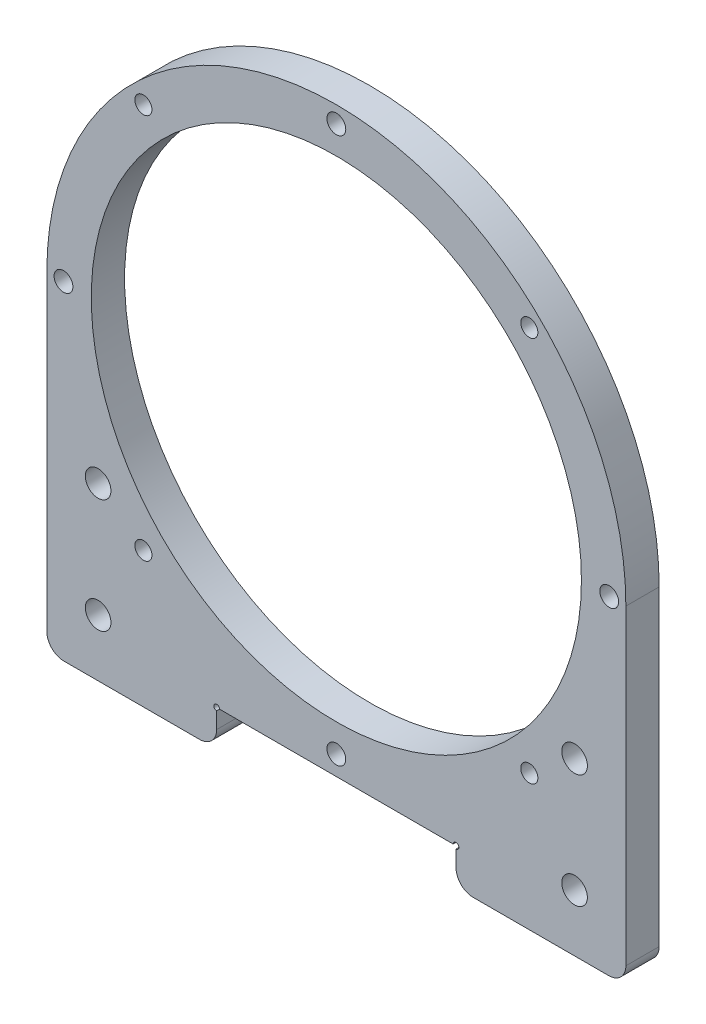
ISO-10303-21;
HEADER;
FILE_DESCRIPTION(('STEP AP214'),'2;1');
FILE_NAME('part.step','',(''),(''),'','','');
FILE_SCHEMA(('AUTOMOTIVE_DESIGN { 1 0 10303 214 1 1 1 1 }'));
ENDSEC;
DATA;
#1=APPLICATION_CONTEXT('core data for automotive mechanical design processes');
#2=APPLICATION_PROTOCOL_DEFINITION('international standard','automotive_design',2000,#1);
#3=PRODUCT_CONTEXT('',#1,'mechanical');
#4=PRODUCT('Part','Part','',(#3));
#5=PRODUCT_RELATED_PRODUCT_CATEGORY('part','',(#4));
#6=PRODUCT_DEFINITION_FORMATION('','',#4);
#7=PRODUCT_DEFINITION_CONTEXT('part definition',#1,'design');
#8=PRODUCT_DEFINITION('design','',#6,#7);
#9=PRODUCT_DEFINITION_SHAPE('','',#8);
#10=(LENGTH_UNIT() NAMED_UNIT(*) SI_UNIT(.MILLI.,.METRE.));
#11=(NAMED_UNIT(*) PLANE_ANGLE_UNIT() SI_UNIT($,.RADIAN.));
#12=(NAMED_UNIT(*) SI_UNIT($,.STERADIAN.) SOLID_ANGLE_UNIT());
#13=UNCERTAINTY_MEASURE_WITH_UNIT(LENGTH_MEASURE(1.E-05),#10,'distance_accuracy_value','');
#14=(GEOMETRIC_REPRESENTATION_CONTEXT(3) GLOBAL_UNCERTAINTY_ASSIGNED_CONTEXT((#13)) GLOBAL_UNIT_ASSIGNED_CONTEXT((#10,
#11,#12)) REPRESENTATION_CONTEXT('',''));
#15=CARTESIAN_POINT('',(0.,0.,0.));
#16=DIRECTION('',(0.,0.,1.));
#17=DIRECTION('',(1.,0.,0.));
#18=AXIS2_PLACEMENT_3D('',#15,#16,#17);
#19=CARTESIAN_POINT('',(0.,-57.658,5.842));
#20=DIRECTION('',(0.,1.,0.));
#21=DIRECTION('',(-1.,0.,0.));
#22=AXIS2_PLACEMENT_3D('',#19,#20,#21);
#23=PLANE('',#22);
#24=DIRECTION('',(1.,0.,0.));
#25=VECTOR('',#24,1.);
#26=CARTESIAN_POINT('',(0.,-57.658,0.));
#27=LINE('',#26,#25);
#28=CARTESIAN_POINT('',(-47.8,-57.658,0.));
#29=VERTEX_POINT('',#28);
#30=CARTESIAN_POINT('',(-24.,-57.658,0.));
#31=VERTEX_POINT('',#30);
#32=EDGE_CURVE('E263',#29,#31,#27,.T.);
#33=ORIENTED_EDGE('',*,*,#32,.T.);
#34=DIRECTION('',(0.,0.,1.));
#35=VECTOR('',#34,1.);
#36=CARTESIAN_POINT('',(-24.,-57.658,5.842));
#37=LINE('',#36,#35);
#38=CARTESIAN_POINT('',(-24.,-57.658,5.842));
#39=VERTEX_POINT('',#38);
#40=EDGE_CURVE('E309',#31,#39,#37,.T.);
#41=ORIENTED_EDGE('',*,*,#40,.T.);
#42=DIRECTION('',(1.,0.,0.));
#43=VECTOR('',#42,1.);
#44=CARTESIAN_POINT('',(0.,-57.658,5.842));
#45=LINE('',#44,#43);
#46=CARTESIAN_POINT('',(-47.8,-57.658,5.842));
#47=VERTEX_POINT('',#46);
#48=EDGE_CURVE('E213',#47,#39,#45,.T.);
#49=ORIENTED_EDGE('',*,*,#48,.F.);
#50=DIRECTION('',(0.,0.,-1.));
#51=VECTOR('',#50,1.);
#52=CARTESIAN_POINT('',(-47.8,-57.658,5.842));
#53=LINE('',#52,#51);
#54=EDGE_CURVE('E306',#47,#29,#53,.T.);
#55=ORIENTED_EDGE('',*,*,#54,.T.);
#56=EDGE_LOOP('',(#33,#41,#49,#55));
#57=FACE_BOUND('',#56,.T.);
#58=ADVANCED_FACE('F35',(#57),#23,.F.);
#59=CARTESIAN_POINT('',(0.,0.,5.842));
#60=DIRECTION('',(0.,0.,-1.));
#61=DIRECTION('',(-1.,0.,0.));
#62=AXIS2_PLACEMENT_3D('',#59,#60,#61);
#63=CYLINDRICAL_SURFACE('',#62,50.8);
#64=CARTESIAN_POINT('',(0.,0.,0.));
#65=DIRECTION('',(0.,0.,1.));
#66=DIRECTION('',(1.,0.,0.));
#67=AXIS2_PLACEMENT_3D('',#64,#65,#66);
#68=CIRCLE('',#67,50.8);
#69=CARTESIAN_POINT('',(-50.8,0.,0.));
#70=VERTEX_POINT('',#69);
#71=CARTESIAN_POINT('',(50.8,0.,0.));
#72=VERTEX_POINT('',#71);
#73=EDGE_CURVE('E254',#70,#72,#68,.F.);
#74=ORIENTED_EDGE('',*,*,#73,.F.);
#75=DIRECTION('',(0.,0.,-1.));
#76=VECTOR('',#75,1.);
#77=CARTESIAN_POINT('',(-50.8,0.,5.842));
#78=LINE('',#77,#76);
#79=CARTESIAN_POINT('',(-50.8,0.,5.842));
#80=VERTEX_POINT('',#79);
#81=EDGE_CURVE('E276',#80,#70,#78,.T.);
#82=ORIENTED_EDGE('',*,*,#81,.F.);
#83=CARTESIAN_POINT('',(0.,0.,5.842));
#84=DIRECTION('',(0.,0.,1.));
#85=DIRECTION('',(1.,0.,0.));
#86=AXIS2_PLACEMENT_3D('',#83,#84,#85);
#87=CIRCLE('',#86,50.8);
#88=CARTESIAN_POINT('',(50.8,0.,5.842));
#89=VERTEX_POINT('',#88);
#90=EDGE_CURVE('E206',#80,#89,#87,.F.);
#91=ORIENTED_EDGE('',*,*,#90,.T.);
#92=DIRECTION('',(0.,0.,-1.));
#93=VECTOR('',#92,1.);
#94=CARTESIAN_POINT('',(50.8,0.,5.842));
#95=LINE('',#94,#93);
#96=EDGE_CURVE('E227',#89,#72,#95,.T.);
#97=ORIENTED_EDGE('',*,*,#96,.T.);
#98=EDGE_LOOP('',(#74,#82,#91,#97));
#99=FACE_BOUND('',#98,.T.);
#100=ADVANCED_FACE('F337',(#99),#63,.T.);
#101=CARTESIAN_POINT('',(-50.8,0.,5.842));
#102=DIRECTION('',(1.,0.,0.));
#103=DIRECTION('',(0.,1.,0.));
#104=AXIS2_PLACEMENT_3D('',#101,#102,#103);
#105=PLANE('',#104);
#106=DIRECTION('',(0.,-1.,0.));
#107=VECTOR('',#106,1.);
#108=CARTESIAN_POINT('',(-50.8,0.,0.));
#109=LINE('',#108,#107);
#110=CARTESIAN_POINT('',(-50.8,-54.658,0.));
#111=VERTEX_POINT('',#110);
#112=EDGE_CURVE('E257',#70,#111,#109,.T.);
#113=ORIENTED_EDGE('',*,*,#112,.T.);
#114=DIRECTION('',(0.,0.,-1.));
#115=VECTOR('',#114,1.);
#116=CARTESIAN_POINT('',(-50.8,-54.658,5.842));
#117=LINE('',#116,#115);
#118=CARTESIAN_POINT('',(-50.8,-54.658,5.842));
#119=VERTEX_POINT('',#118);
#120=EDGE_CURVE('E11',#111,#119,#117,.F.);
#121=ORIENTED_EDGE('',*,*,#120,.T.);
#122=DIRECTION('',(0.,-1.,0.));
#123=VECTOR('',#122,1.);
#124=CARTESIAN_POINT('',(-50.8,0.,5.842));
#125=LINE('',#124,#123);
#126=EDGE_CURVE('E209',#80,#119,#125,.T.);
#127=ORIENTED_EDGE('',*,*,#126,.F.);
#128=ORIENTED_EDGE('',*,*,#81,.T.);
#129=EDGE_LOOP('',(#113,#121,#127,#128));
#130=FACE_BOUND('',#129,.T.);
#131=ADVANCED_FACE('F335',(#130),#105,.F.);
#132=CARTESIAN_POINT('',(24.,-57.658,0.));
#133=VERTEX_POINT('',#132);
#134=CARTESIAN_POINT('',(47.8,-57.658,0.));
#135=VERTEX_POINT('',#134);
#136=EDGE_CURVE('E260',#133,#135,#27,.T.);
#137=ORIENTED_EDGE('',*,*,#136,.T.);
#138=DIRECTION('',(0.,0.,-1.));
#139=VECTOR('',#138,1.);
#140=CARTESIAN_POINT('',(47.8,-57.658,5.842));
#141=LINE('',#140,#139);
#142=CARTESIAN_POINT('',(47.8,-57.658,5.842));
#143=VERTEX_POINT('',#142);
#144=EDGE_CURVE('E294',#135,#143,#141,.F.);
#145=ORIENTED_EDGE('',*,*,#144,.T.);
#146=CARTESIAN_POINT('',(24.,-57.658,5.842));
#147=VERTEX_POINT('',#146);
#148=EDGE_CURVE('E212',#147,#143,#45,.T.);
#149=ORIENTED_EDGE('',*,*,#148,.F.);
#150=DIRECTION('',(0.,0.,1.));
#151=VECTOR('',#150,1.);
#152=CARTESIAN_POINT('',(24.,-57.658,5.842));
#153=LINE('',#152,#151);
#154=EDGE_CURVE('E292',#147,#133,#153,.F.);
#155=ORIENTED_EDGE('',*,*,#154,.T.);
#156=EDGE_LOOP('',(#137,#145,#149,#155));
#157=FACE_BOUND('',#156,.T.);
#158=ADVANCED_FACE('F350',(#157),#23,.F.);
#159=CARTESIAN_POINT('',(0.,47.879,5.842));
#160=DIRECTION('',(0.,0.,-1.));
#161=DIRECTION('',(-1.,0.,0.));
#162=AXIS2_PLACEMENT_3D('',#159,#160,#161);
#163=CYLINDRICAL_SURFACE('',#162,1.65);
#164=CARTESIAN_POINT('',(0.,47.879,5.842));
#165=DIRECTION('',(0.,0.,1.));
#166=DIRECTION('',(1.,0.,0.));
#167=AXIS2_PLACEMENT_3D('',#164,#165,#166);
#168=CIRCLE('',#167,1.65);
#169=CARTESIAN_POINT('',(1.65,47.879,5.842));
#170=VERTEX_POINT('',#169);
#171=EDGE_CURVE('E221',#170,#170,#168,.T.);
#172=ORIENTED_EDGE('',*,*,#171,.T.);
#173=EDGE_LOOP('',(#172));
#174=FACE_BOUND('',#173,.T.);
#175=CARTESIAN_POINT('',(0.,47.879,0.));
#176=DIRECTION('',(0.,0.,1.));
#177=DIRECTION('',(1.,0.,0.));
#178=AXIS2_PLACEMENT_3D('',#175,#176,#177);
#179=CIRCLE('',#178,1.65);
#180=CARTESIAN_POINT('',(1.65,47.879,0.));
#181=VERTEX_POINT('',#180);
#182=EDGE_CURVE('E270',#181,#181,#179,.T.);
#183=ORIENTED_EDGE('',*,*,#182,.F.);
#184=EDGE_LOOP('',(#183));
#185=FACE_BOUND('',#184,.T.);
#186=ADVANCED_FACE('F386',(#174,#185),#163,.F.);
#187=CARTESIAN_POINT('',(-47.879,0.,5.842));
#188=DIRECTION('',(0.,0.,-1.));
#189=DIRECTION('',(-1.,0.,0.));
#190=AXIS2_PLACEMENT_3D('',#187,#188,#189);
#191=CYLINDRICAL_SURFACE('',#190,1.65);
#192=CARTESIAN_POINT('',(-47.879,0.,5.842));
#193=DIRECTION('',(0.,0.,1.));
#194=DIRECTION('',(1.,0.,0.));
#195=AXIS2_PLACEMENT_3D('',#192,#193,#194);
#196=CIRCLE('',#195,1.65);
#197=CARTESIAN_POINT('',(-46.229,0.,5.842));
#198=VERTEX_POINT('',#197);
#199=EDGE_CURVE('E218',#198,#198,#196,.T.);
#200=ORIENTED_EDGE('',*,*,#199,.T.);
#201=EDGE_LOOP('',(#200));
#202=FACE_BOUND('',#201,.T.);
#203=CARTESIAN_POINT('',(-47.879,0.,0.));
#204=DIRECTION('',(0.,0.,1.));
#205=DIRECTION('',(1.,0.,0.));
#206=AXIS2_PLACEMENT_3D('',#203,#204,#205);
#207=CIRCLE('',#206,1.65);
#208=CARTESIAN_POINT('',(-46.229,0.,0.));
#209=VERTEX_POINT('',#208);
#210=EDGE_CURVE('E267',#209,#209,#207,.T.);
#211=ORIENTED_EDGE('',*,*,#210,.F.);
#212=EDGE_LOOP('',(#211));
#213=FACE_BOUND('',#212,.T.);
#214=ADVANCED_FACE('F391',(#202,#213),#191,.F.);
#215=CARTESIAN_POINT('',(50.8,0.,5.842));
#216=DIRECTION('',(1.,0.,0.));
#217=DIRECTION('',(0.,1.,0.));
#218=AXIS2_PLACEMENT_3D('',#215,#216,#217);
#219=PLANE('',#218);
#220=DIRECTION('',(0.,-1.,0.));
#221=VECTOR('',#220,1.);
#222=CARTESIAN_POINT('',(50.8,0.,5.842));
#223=LINE('',#222,#221);
#224=CARTESIAN_POINT('',(50.8,-54.658,5.842));
#225=VERTEX_POINT('',#224);
#226=EDGE_CURVE('E215',#89,#225,#223,.T.);
#227=ORIENTED_EDGE('',*,*,#226,.T.);
#228=DIRECTION('',(0.,0.,-1.));
#229=VECTOR('',#228,1.);
#230=CARTESIAN_POINT('',(50.8,-54.658,0.));
#231=LINE('',#230,#229);
#232=CARTESIAN_POINT('',(50.8,-54.658,0.));
#233=VERTEX_POINT('',#232);
#234=EDGE_CURVE('E281',#225,#233,#231,.T.);
#235=ORIENTED_EDGE('',*,*,#234,.T.);
#236=DIRECTION('',(0.,-1.,0.));
#237=VECTOR('',#236,1.);
#238=CARTESIAN_POINT('',(50.8,0.,0.));
#239=LINE('',#238,#237);
#240=EDGE_CURVE('E264',#72,#233,#239,.T.);
#241=ORIENTED_EDGE('',*,*,#240,.F.);
#242=ORIENTED_EDGE('',*,*,#96,.F.);
#243=EDGE_LOOP('',(#227,#235,#241,#242));
#244=FACE_BOUND('',#243,.T.);
#245=ADVANCED_FACE('F341',(#244),#219,.T.);
#246=CARTESIAN_POINT('',(41.8,-47.658,5.842));
#247=DIRECTION('',(0.,0.,-1.));
#248=DIRECTION('',(-1.,0.,0.));
#249=AXIS2_PLACEMENT_3D('',#246,#247,#248);
#250=CYLINDRICAL_SURFACE('',#249,2.25);
#251=CARTESIAN_POINT('',(41.8,-47.658,5.842));
#252=DIRECTION('',(0.,0.,1.));
#253=DIRECTION('',(1.,0.,0.));
#254=AXIS2_PLACEMENT_3D('',#251,#252,#253);
#255=CIRCLE('',#254,2.25);
#256=CARTESIAN_POINT('',(44.05,-47.658,5.842));
#257=VERTEX_POINT('',#256);
#258=EDGE_CURVE('E203',#257,#257,#255,.F.);
#259=ORIENTED_EDGE('',*,*,#258,.F.);
#260=EDGE_LOOP('',(#259));
#261=FACE_BOUND('',#260,.T.);
#262=CARTESIAN_POINT('',(41.8,-47.658,0.));
#263=DIRECTION('',(0.,0.,1.));
#264=DIRECTION('',(1.,0.,0.));
#265=AXIS2_PLACEMENT_3D('',#262,#263,#264);
#266=CIRCLE('',#265,2.25);
#267=CARTESIAN_POINT('',(44.05,-47.658,0.));
#268=VERTEX_POINT('',#267);
#269=EDGE_CURVE('E251',#268,#268,#266,.F.);
#270=ORIENTED_EDGE('',*,*,#269,.T.);
#271=EDGE_LOOP('',(#270));
#272=FACE_BOUND('',#271,.T.);
#273=ADVANCED_FACE('F397',(#261,#272),#250,.F.);
#274=CARTESIAN_POINT('',(47.879,0.,5.842));
#275=DIRECTION('',(0.,0.,-1.));
#276=DIRECTION('',(-1.,0.,0.));
#277=AXIS2_PLACEMENT_3D('',#274,#275,#276);
#278=CYLINDRICAL_SURFACE('',#277,1.65);
#279=CARTESIAN_POINT('',(47.879,0.,5.842));
#280=DIRECTION('',(0.,0.,1.));
#281=DIRECTION('',(1.,0.,0.));
#282=AXIS2_PLACEMENT_3D('',#279,#280,#281);
#283=CIRCLE('',#282,1.65);
#284=CARTESIAN_POINT('',(49.529,0.,5.842));
#285=VERTEX_POINT('',#284);
#286=EDGE_CURVE('E200',#285,#285,#283,.T.);
#287=ORIENTED_EDGE('',*,*,#286,.T.);
#288=EDGE_LOOP('',(#287));
#289=FACE_BOUND('',#288,.T.);
#290=CARTESIAN_POINT('',(47.879,0.,0.));
#291=DIRECTION('',(0.,0.,1.));
#292=DIRECTION('',(1.,0.,0.));
#293=AXIS2_PLACEMENT_3D('',#290,#291,#292);
#294=CIRCLE('',#293,1.65);
#295=CARTESIAN_POINT('',(49.529,0.,0.));
#296=VERTEX_POINT('',#295);
#297=EDGE_CURVE('E248',#296,#296,#294,.T.);
#298=ORIENTED_EDGE('',*,*,#297,.F.);
#299=EDGE_LOOP('',(#298));
#300=FACE_BOUND('',#299,.T.);
#301=ADVANCED_FACE('F400',(#289,#300),#278,.F.);
#302=CARTESIAN_POINT('',(0.,-47.879,5.842));
#303=DIRECTION('',(0.,0.,-1.));
#304=DIRECTION('',(-1.,0.,0.));
#305=AXIS2_PLACEMENT_3D('',#302,#303,#304);
#306=CYLINDRICAL_SURFACE('',#305,1.65);
#307=CARTESIAN_POINT('',(0.,-47.879,5.842));
#308=DIRECTION('',(0.,0.,1.));
#309=DIRECTION('',(1.,0.,0.));
#310=AXIS2_PLACEMENT_3D('',#307,#308,#309);
#311=CIRCLE('',#310,1.65);
#312=CARTESIAN_POINT('',(1.65000000000001,-47.879,5.842));
#313=VERTEX_POINT('',#312);
#314=EDGE_CURVE('E197',#313,#313,#311,.T.);
#315=ORIENTED_EDGE('',*,*,#314,.T.);
#316=EDGE_LOOP('',(#315));
#317=FACE_BOUND('',#316,.T.);
#318=CARTESIAN_POINT('',(0.,-47.879,0.));
#319=DIRECTION('',(0.,0.,1.));
#320=DIRECTION('',(1.,0.,0.));
#321=AXIS2_PLACEMENT_3D('',#318,#319,#320);
#322=CIRCLE('',#321,1.65);
#323=CARTESIAN_POINT('',(1.65000000000001,-47.879,0.));
#324=VERTEX_POINT('',#323);
#325=EDGE_CURVE('E245',#324,#324,#322,.T.);
#326=ORIENTED_EDGE('',*,*,#325,.F.);
#327=EDGE_LOOP('',(#326));
#328=FACE_BOUND('',#327,.T.);
#329=ADVANCED_FACE('F404',(#317,#328),#306,.F.);
#330=CARTESIAN_POINT('',(-33.8555655764305,33.8555655764309,5.842));
#331=DIRECTION('',(0.,0.,-1.));
#332=DIRECTION('',(-1.,0.,0.));
#333=AXIS2_PLACEMENT_3D('',#330,#331,#332);
#334=CYLINDRICAL_SURFACE('',#333,1.50000000000001);
#335=CARTESIAN_POINT('',(-33.8555655764305,33.8555655764309,5.842));
#336=DIRECTION('',(0.,0.,1.));
#337=DIRECTION('',(1.,0.,0.));
#338=AXIS2_PLACEMENT_3D('',#335,#336,#337);
#339=CIRCLE('',#338,1.50000000000001);
#340=CARTESIAN_POINT('',(-32.3555655764305,33.8555655764309,5.842));
#341=VERTEX_POINT('',#340);
#342=EDGE_CURVE('E194',#341,#341,#339,.T.);
#343=ORIENTED_EDGE('',*,*,#342,.T.);
#344=EDGE_LOOP('',(#343));
#345=FACE_BOUND('',#344,.T.);
#346=CARTESIAN_POINT('',(-33.8555655764305,33.8555655764309,0.));
#347=DIRECTION('',(0.,0.,1.));
#348=DIRECTION('',(1.,0.,0.));
#349=AXIS2_PLACEMENT_3D('',#346,#347,#348);
#350=CIRCLE('',#349,1.50000000000001);
#351=CARTESIAN_POINT('',(-32.3555655764305,33.8555655764309,0.));
#352=VERTEX_POINT('',#351);
#353=EDGE_CURVE('E242',#352,#352,#350,.T.);
#354=ORIENTED_EDGE('',*,*,#353,.F.);
#355=EDGE_LOOP('',(#354));
#356=FACE_BOUND('',#355,.T.);
#357=ADVANCED_FACE('F408',(#345,#356),#334,.F.);
#358=CARTESIAN_POINT('',(33.8555655764309,33.8555655764305,5.842));
#359=DIRECTION('',(0.,0.,-1.));
#360=DIRECTION('',(-1.,0.,0.));
#361=AXIS2_PLACEMENT_3D('',#358,#359,#360);
#362=CYLINDRICAL_SURFACE('',#361,1.5);
#363=CARTESIAN_POINT('',(33.8555655764309,33.8555655764305,5.842));
#364=DIRECTION('',(0.,0.,1.));
#365=DIRECTION('',(1.,0.,0.));
#366=AXIS2_PLACEMENT_3D('',#363,#364,#365);
#367=CIRCLE('',#366,1.5);
#368=CARTESIAN_POINT('',(35.3555655764309,33.8555655764305,5.842));
#369=VERTEX_POINT('',#368);
#370=EDGE_CURVE('E191',#369,#369,#367,.T.);
#371=ORIENTED_EDGE('',*,*,#370,.T.);
#372=EDGE_LOOP('',(#371));
#373=FACE_BOUND('',#372,.T.);
#374=CARTESIAN_POINT('',(33.8555655764309,33.8555655764305,0.));
#375=DIRECTION('',(0.,0.,1.));
#376=DIRECTION('',(1.,0.,0.));
#377=AXIS2_PLACEMENT_3D('',#374,#375,#376);
#378=CIRCLE('',#377,1.5);
#379=CARTESIAN_POINT('',(35.3555655764309,33.8555655764305,0.));
#380=VERTEX_POINT('',#379);
#381=EDGE_CURVE('E239',#380,#380,#378,.T.);
#382=ORIENTED_EDGE('',*,*,#381,.F.);
#383=EDGE_LOOP('',(#382));
#384=FACE_BOUND('',#383,.T.);
#385=ADVANCED_FACE('F412',(#373,#384),#362,.F.);
#386=CARTESIAN_POINT('',(33.8555655764305,-33.8555655764309,5.842));
#387=DIRECTION('',(0.,0.,-1.));
#388=DIRECTION('',(-1.,0.,0.));
#389=AXIS2_PLACEMENT_3D('',#386,#387,#388);
#390=CYLINDRICAL_SURFACE('',#389,1.50000000000001);
#391=CARTESIAN_POINT('',(33.8555655764305,-33.8555655764309,5.842));
#392=DIRECTION('',(0.,0.,1.));
#393=DIRECTION('',(1.,0.,0.));
#394=AXIS2_PLACEMENT_3D('',#391,#392,#393);
#395=CIRCLE('',#394,1.50000000000001);
#396=CARTESIAN_POINT('',(35.3555655764305,-33.8555655764309,5.842));
#397=VERTEX_POINT('',#396);
#398=EDGE_CURVE('E188',#397,#397,#395,.T.);
#399=ORIENTED_EDGE('',*,*,#398,.T.);
#400=EDGE_LOOP('',(#399));
#401=FACE_BOUND('',#400,.T.);
#402=CARTESIAN_POINT('',(33.8555655764305,-33.8555655764309,0.));
#403=DIRECTION('',(0.,0.,1.));
#404=DIRECTION('',(1.,0.,0.));
#405=AXIS2_PLACEMENT_3D('',#402,#403,#404);
#406=CIRCLE('',#405,1.50000000000001);
#407=CARTESIAN_POINT('',(35.3555655764305,-33.8555655764309,0.));
#408=VERTEX_POINT('',#407);
#409=EDGE_CURVE('E236',#408,#408,#406,.T.);
#410=ORIENTED_EDGE('',*,*,#409,.F.);
#411=EDGE_LOOP('',(#410));
#412=FACE_BOUND('',#411,.T.);
#413=ADVANCED_FACE('F416',(#401,#412),#390,.F.);
#414=CARTESIAN_POINT('',(-33.8555655764309,-33.8555655764305,5.842));
#415=DIRECTION('',(0.,0.,-1.));
#416=DIRECTION('',(-1.,0.,0.));
#417=AXIS2_PLACEMENT_3D('',#414,#415,#416);
#418=CYLINDRICAL_SURFACE('',#417,1.50000000000001);
#419=CARTESIAN_POINT('',(-33.8555655764309,-33.8555655764305,5.842));
#420=DIRECTION('',(0.,0.,1.));
#421=DIRECTION('',(1.,0.,0.));
#422=AXIS2_PLACEMENT_3D('',#419,#420,#421);
#423=CIRCLE('',#422,1.50000000000001);
#424=CARTESIAN_POINT('',(-32.3555655764309,-33.8555655764305,5.842));
#425=VERTEX_POINT('',#424);
#426=EDGE_CURVE('E185',#425,#425,#423,.T.);
#427=ORIENTED_EDGE('',*,*,#426,.T.);
#428=EDGE_LOOP('',(#427));
#429=FACE_BOUND('',#428,.T.);
#430=CARTESIAN_POINT('',(-33.8555655764309,-33.8555655764305,0.));
#431=DIRECTION('',(0.,0.,1.));
#432=DIRECTION('',(1.,0.,0.));
#433=AXIS2_PLACEMENT_3D('',#430,#431,#432);
#434=CIRCLE('',#433,1.50000000000001);
#435=CARTESIAN_POINT('',(-32.3555655764309,-33.8555655764305,0.));
#436=VERTEX_POINT('',#435);
#437=EDGE_CURVE('E233',#436,#436,#434,.T.);
#438=ORIENTED_EDGE('',*,*,#437,.F.);
#439=EDGE_LOOP('',(#438));
#440=FACE_BOUND('',#439,.T.);
#441=ADVANCED_FACE('F420',(#429,#440),#418,.F.);
#442=CARTESIAN_POINT('',(-41.8,-27.658,5.842));
#443=DIRECTION('',(0.,0.,-1.));
#444=DIRECTION('',(-1.,0.,0.));
#445=AXIS2_PLACEMENT_3D('',#442,#443,#444);
#446=CYLINDRICAL_SURFACE('',#445,2.25);
#447=CARTESIAN_POINT('',(-41.8,-27.658,5.842));
#448=DIRECTION('',(0.,0.,1.));
#449=DIRECTION('',(1.,0.,0.));
#450=AXIS2_PLACEMENT_3D('',#447,#448,#449);
#451=CIRCLE('',#450,2.25);
#452=CARTESIAN_POINT('',(-39.55,-27.658,5.842));
#453=VERTEX_POINT('',#452);
#454=EDGE_CURVE('E181',#453,#453,#451,.T.);
#455=ORIENTED_EDGE('',*,*,#454,.T.);
#456=EDGE_LOOP('',(#455));
#457=FACE_BOUND('',#456,.T.);
#458=CARTESIAN_POINT('',(-41.8,-27.658,0.));
#459=DIRECTION('',(0.,0.,1.));
#460=DIRECTION('',(1.,0.,0.));
#461=AXIS2_PLACEMENT_3D('',#458,#459,#460);
#462=CIRCLE('',#461,2.25);
#463=CARTESIAN_POINT('',(-39.55,-27.658,0.));
#464=VERTEX_POINT('',#463);
#465=EDGE_CURVE('E230',#464,#464,#462,.T.);
#466=ORIENTED_EDGE('',*,*,#465,.F.);
#467=EDGE_LOOP('',(#466));
#468=FACE_BOUND('',#467,.T.);
#469=ADVANCED_FACE('F424',(#457,#468),#446,.F.);
#470=CARTESIAN_POINT('',(-41.8,-47.658,5.842));
#471=DIRECTION('',(0.,0.,-1.));
#472=DIRECTION('',(-1.,0.,0.));
#473=AXIS2_PLACEMENT_3D('',#470,#471,#472);
#474=CYLINDRICAL_SURFACE('',#473,2.25);
#475=CARTESIAN_POINT('',(-41.8,-47.658,5.842));
#476=DIRECTION('',(0.,0.,1.));
#477=DIRECTION('',(1.,0.,0.));
#478=AXIS2_PLACEMENT_3D('',#475,#476,#477);
#479=CIRCLE('',#478,2.25);
#480=CARTESIAN_POINT('',(-39.55,-47.658,5.842));
#481=VERTEX_POINT('',#480);
#482=EDGE_CURVE('E178',#481,#481,#479,.T.);
#483=ORIENTED_EDGE('',*,*,#482,.T.);
#484=EDGE_LOOP('',(#483));
#485=FACE_BOUND('',#484,.T.);
#486=CARTESIAN_POINT('',(-41.8,-47.658,0.));
#487=DIRECTION('',(0.,0.,1.));
#488=DIRECTION('',(1.,0.,0.));
#489=AXIS2_PLACEMENT_3D('',#486,#487,#488);
#490=CIRCLE('',#489,2.25);
#491=CARTESIAN_POINT('',(-39.55,-47.658,0.));
#492=VERTEX_POINT('',#491);
#493=EDGE_CURVE('E174',#492,#492,#490,.T.);
#494=ORIENTED_EDGE('',*,*,#493,.F.);
#495=EDGE_LOOP('',(#494));
#496=FACE_BOUND('',#495,.T.);
#497=ADVANCED_FACE('F428',(#485,#496),#474,.F.);
#498=CARTESIAN_POINT('',(41.8,-27.658,5.842));
#499=DIRECTION('',(0.,0.,-1.));
#500=DIRECTION('',(-1.,0.,0.));
#501=AXIS2_PLACEMENT_3D('',#498,#499,#500);
#502=CYLINDRICAL_SURFACE('',#501,2.25);
#503=CARTESIAN_POINT('',(41.8,-27.658,5.842));
#504=DIRECTION('',(0.,0.,1.));
#505=DIRECTION('',(1.,0.,0.));
#506=AXIS2_PLACEMENT_3D('',#503,#504,#505);
#507=CIRCLE('',#506,2.25);
#508=CARTESIAN_POINT('',(44.05,-27.658,5.842));
#509=VERTEX_POINT('',#508);
#510=EDGE_CURVE('E224',#509,#509,#507,.F.);
#511=ORIENTED_EDGE('',*,*,#510,.F.);
#512=EDGE_LOOP('',(#511));
#513=FACE_BOUND('',#512,.T.);
#514=CARTESIAN_POINT('',(41.8,-27.658,0.));
#515=DIRECTION('',(0.,0.,1.));
#516=DIRECTION('',(1.,0.,0.));
#517=AXIS2_PLACEMENT_3D('',#514,#515,#516);
#518=CIRCLE('',#517,2.25);
#519=CARTESIAN_POINT('',(44.05,-27.658,0.));
#520=VERTEX_POINT('',#519);
#521=EDGE_CURVE('E182',#520,#520,#518,.F.);
#522=ORIENTED_EDGE('',*,*,#521,.T.);
#523=EDGE_LOOP('',(#522));
#524=FACE_BOUND('',#523,.T.);
#525=ADVANCED_FACE('F432',(#513,#524),#502,.F.);
#526=CARTESIAN_POINT('',(0.,0.,5.842));
#527=DIRECTION('',(0.,0.,1.));
#528=DIRECTION('',(1.,0.,0.));
#529=AXIS2_PLACEMENT_3D('',#526,#527,#528);
#530=PLANE('',#529);
#531=ORIENTED_EDGE('',*,*,#148,.T.);
#532=CARTESIAN_POINT('',(47.8,-54.658,5.842));
#533=DIRECTION('',(0.,0.,1.));
#534=DIRECTION('',(1.,0.,0.));
#535=AXIS2_PLACEMENT_3D('',#532,#533,#534);
#536=CIRCLE('',#535,3.);
#537=EDGE_CURVE('E301',#143,#225,#536,.T.);
#538=ORIENTED_EDGE('',*,*,#537,.T.);
#539=ORIENTED_EDGE('',*,*,#226,.F.);
#540=ORIENTED_EDGE('',*,*,#90,.F.);
#541=ORIENTED_EDGE('',*,*,#126,.T.);
#542=CARTESIAN_POINT('',(-47.8,-54.658,5.842));
#543=DIRECTION('',(0.,0.,1.));
#544=DIRECTION('',(1.,0.,0.));
#545=AXIS2_PLACEMENT_3D('',#542,#543,#544);
#546=CIRCLE('',#545,3.);
#547=EDGE_CURVE('E296',#119,#47,#546,.T.);
#548=ORIENTED_EDGE('',*,*,#547,.T.);
#549=ORIENTED_EDGE('',*,*,#48,.T.);
#550=CARTESIAN_POINT('',(-24.,-54.658,5.842));
#551=DIRECTION('',(0.,0.,1.));
#552=DIRECTION('',(1.,0.,0.));
#553=AXIS2_PLACEMENT_3D('',#550,#551,#552);
#554=CIRCLE('',#553,3.);
#555=CARTESIAN_POINT('',(-21.,-54.658,5.842));
#556=VERTEX_POINT('',#555);
#557=EDGE_CURVE('E50',#39,#556,#554,.T.);
#558=ORIENTED_EDGE('',*,*,#557,.T.);
#559=DIRECTION('',(0.,-1.,0.));
#560=VECTOR('',#559,1.);
#561=CARTESIAN_POINT('',(-21.,-57.658,5.842));
#562=LINE('',#561,#560);
#563=CARTESIAN_POINT('',(-21.,-51.808,5.842));
#564=VERTEX_POINT('',#563);
#565=EDGE_CURVE('E167',#564,#556,#562,.T.);
#566=ORIENTED_EDGE('',*,*,#565,.F.);
#567=CARTESIAN_POINT('',(-21.,-51.308,5.842));
#568=DIRECTION('',(0.,0.,1.));
#569=DIRECTION('',(1.,0.,0.));
#570=AXIS2_PLACEMENT_3D('',#567,#568,#569);
#571=CIRCLE('',#570,0.499999999999999);
#572=CARTESIAN_POINT('',(-20.5,-51.308,5.842));
#573=VERTEX_POINT('',#572);
#574=EDGE_CURVE('E155',#573,#564,#571,.T.);
#575=ORIENTED_EDGE('',*,*,#574,.F.);
#576=DIRECTION('',(-1.,0.,0.));
#577=VECTOR('',#576,1.);
#578=CARTESIAN_POINT('',(-21.,-51.308,5.842));
#579=LINE('',#578,#577);
#580=CARTESIAN_POINT('',(20.5,-51.308,5.842));
#581=VERTEX_POINT('',#580);
#582=EDGE_CURVE('E152',#581,#573,#579,.T.);
#583=ORIENTED_EDGE('',*,*,#582,.F.);
#584=CARTESIAN_POINT('',(21.,-51.308,5.842));
#585=DIRECTION('',(0.,0.,1.));
#586=DIRECTION('',(1.,0.,0.));
#587=AXIS2_PLACEMENT_3D('',#584,#585,#586);
#588=CIRCLE('',#587,0.499999999999999);
#589=CARTESIAN_POINT('',(21.,-51.808,5.842));
#590=VERTEX_POINT('',#589);
#591=EDGE_CURVE('E136',#590,#581,#588,.T.);
#592=ORIENTED_EDGE('',*,*,#591,.F.);
#593=DIRECTION('',(0.,1.,0.));
#594=VECTOR('',#593,1.);
#595=CARTESIAN_POINT('',(21.,-57.658,5.842));
#596=LINE('',#595,#594);
#597=CARTESIAN_POINT('',(21.,-54.658,5.842));
#598=VERTEX_POINT('',#597);
#599=EDGE_CURVE('E162',#598,#590,#596,.T.);
#600=ORIENTED_EDGE('',*,*,#599,.F.);
#601=CARTESIAN_POINT('',(24.,-54.658,5.842));
#602=DIRECTION('',(0.,0.,1.));
#603=DIRECTION('',(1.,0.,0.));
#604=AXIS2_PLACEMENT_3D('',#601,#602,#603);
#605=CIRCLE('',#604,3.);
#606=EDGE_CURVE('E299',#598,#147,#605,.T.);
#607=ORIENTED_EDGE('',*,*,#606,.T.);
#608=EDGE_LOOP('',(#531,#538,#539,#540,#541,#548,#549,#558,#566,#575,#583,#592,#600,#607));
#609=FACE_BOUND('',#608,.T.);
#610=ORIENTED_EDGE('',*,*,#482,.F.);
#611=EDGE_LOOP('',(#610));
#612=FACE_BOUND('',#611,.T.);
#613=ORIENTED_EDGE('',*,*,#454,.F.);
#614=EDGE_LOOP('',(#613));
#615=FACE_BOUND('',#614,.T.);
#616=ORIENTED_EDGE('',*,*,#426,.F.);
#617=EDGE_LOOP('',(#616));
#618=FACE_BOUND('',#617,.T.);
#619=ORIENTED_EDGE('',*,*,#398,.F.);
#620=EDGE_LOOP('',(#619));
#621=FACE_BOUND('',#620,.T.);
#622=ORIENTED_EDGE('',*,*,#370,.F.);
#623=EDGE_LOOP('',(#622));
#624=FACE_BOUND('',#623,.T.);
#625=ORIENTED_EDGE('',*,*,#342,.F.);
#626=EDGE_LOOP('',(#625));
#627=FACE_BOUND('',#626,.T.);
#628=ORIENTED_EDGE('',*,*,#314,.F.);
#629=EDGE_LOOP('',(#628));
#630=FACE_BOUND('',#629,.T.);
#631=ORIENTED_EDGE('',*,*,#286,.F.);
#632=EDGE_LOOP('',(#631));
#633=FACE_BOUND('',#632,.T.);
#634=ORIENTED_EDGE('',*,*,#258,.T.);
#635=EDGE_LOOP('',(#634));
#636=FACE_BOUND('',#635,.T.);
#637=ORIENTED_EDGE('',*,*,#199,.F.);
#638=EDGE_LOOP('',(#637));
#639=FACE_BOUND('',#638,.T.);
#640=ORIENTED_EDGE('',*,*,#171,.F.);
#641=EDGE_LOOP('',(#640));
#642=FACE_BOUND('',#641,.T.);
#643=ORIENTED_EDGE('',*,*,#510,.T.);
#644=EDGE_LOOP('',(#643));
#645=FACE_BOUND('',#644,.T.);
#646=CARTESIAN_POINT('',(0.,0.,5.842));
#647=DIRECTION('',(0.,0.,1.));
#648=DIRECTION('',(1.,0.,0.));
#649=AXIS2_PLACEMENT_3D('',#646,#647,#648);
#650=CIRCLE('',#649,43.);
#651=CARTESIAN_POINT('',(43.,0.,5.842));
#652=VERTEX_POINT('',#651);
#653=EDGE_CURVE('E175',#652,#652,#650,.T.);
#654=ORIENTED_EDGE('',*,*,#653,.F.);
#655=EDGE_LOOP('',(#654));
#656=FACE_BOUND('',#655,.T.);
#657=ADVANCED_FACE('F159',(#609,#612,#615,#618,#621,#624,#627,#630,#633,#636,#639,#642,#645,
#656),#530,.T.);
#658=CARTESIAN_POINT('',(0.,0.,0.));
#659=DIRECTION('',(0.,0.,1.));
#660=DIRECTION('',(1.,0.,0.));
#661=AXIS2_PLACEMENT_3D('',#658,#659,#660);
#662=PLANE('',#661);
#663=ORIENTED_EDGE('',*,*,#493,.T.);
#664=EDGE_LOOP('',(#663));
#665=FACE_BOUND('',#664,.T.);
#666=ORIENTED_EDGE('',*,*,#465,.T.);
#667=EDGE_LOOP('',(#666));
#668=FACE_BOUND('',#667,.T.);
#669=ORIENTED_EDGE('',*,*,#437,.T.);
#670=EDGE_LOOP('',(#669));
#671=FACE_BOUND('',#670,.T.);
#672=ORIENTED_EDGE('',*,*,#409,.T.);
#673=EDGE_LOOP('',(#672));
#674=FACE_BOUND('',#673,.T.);
#675=ORIENTED_EDGE('',*,*,#381,.T.);
#676=EDGE_LOOP('',(#675));
#677=FACE_BOUND('',#676,.T.);
#678=ORIENTED_EDGE('',*,*,#353,.T.);
#679=EDGE_LOOP('',(#678));
#680=FACE_BOUND('',#679,.T.);
#681=ORIENTED_EDGE('',*,*,#325,.T.);
#682=EDGE_LOOP('',(#681));
#683=FACE_BOUND('',#682,.T.);
#684=ORIENTED_EDGE('',*,*,#297,.T.);
#685=EDGE_LOOP('',(#684));
#686=FACE_BOUND('',#685,.T.);
#687=ORIENTED_EDGE('',*,*,#269,.F.);
#688=EDGE_LOOP('',(#687));
#689=FACE_BOUND('',#688,.T.);
#690=ORIENTED_EDGE('',*,*,#240,.T.);
#691=CARTESIAN_POINT('',(47.8,-54.658,0.));
#692=DIRECTION('',(0.,0.,1.));
#693=DIRECTION('',(1.,0.,0.));
#694=AXIS2_PLACEMENT_3D('',#691,#692,#693);
#695=CIRCLE('',#694,3.);
#696=EDGE_CURVE('E290',#233,#135,#695,.F.);
#697=ORIENTED_EDGE('',*,*,#696,.T.);
#698=ORIENTED_EDGE('',*,*,#136,.F.);
#699=CARTESIAN_POINT('',(24.,-54.658,0.));
#700=DIRECTION('',(0.,0.,1.));
#701=DIRECTION('',(1.,0.,0.));
#702=AXIS2_PLACEMENT_3D('',#699,#700,#701);
#703=CIRCLE('',#702,3.);
#704=CARTESIAN_POINT('',(21.,-54.658,0.));
#705=VERTEX_POINT('',#704);
#706=EDGE_CURVE('E288',#133,#705,#703,.F.);
#707=ORIENTED_EDGE('',*,*,#706,.T.);
#708=DIRECTION('',(0.,1.,0.));
#709=VECTOR('',#708,1.);
#710=CARTESIAN_POINT('',(21.,-57.658,0.));
#711=LINE('',#710,#709);
#712=CARTESIAN_POINT('',(21.,-51.808,0.));
#713=VERTEX_POINT('',#712);
#714=EDGE_CURVE('E165',#705,#713,#711,.T.);
#715=ORIENTED_EDGE('',*,*,#714,.T.);
#716=CARTESIAN_POINT('',(21.,-51.308,0.));
#717=DIRECTION('',(0.,0.,1.));
#718=DIRECTION('',(1.,0.,0.));
#719=AXIS2_PLACEMENT_3D('',#716,#717,#718);
#720=CIRCLE('',#719,0.499999999999999);
#721=CARTESIAN_POINT('',(20.5,-51.308,0.));
#722=VERTEX_POINT('',#721);
#723=EDGE_CURVE('E146',#713,#722,#720,.T.);
#724=ORIENTED_EDGE('',*,*,#723,.T.);
#725=DIRECTION('',(-1.,0.,0.));
#726=VECTOR('',#725,1.);
#727=CARTESIAN_POINT('',(-21.,-51.308,0.));
#728=LINE('',#727,#726);
#729=CARTESIAN_POINT('',(-20.5,-51.308,0.));
#730=VERTEX_POINT('',#729);
#731=EDGE_CURVE('E154',#722,#730,#728,.T.);
#732=ORIENTED_EDGE('',*,*,#731,.T.);
#733=CARTESIAN_POINT('',(-21.,-51.308,0.));
#734=DIRECTION('',(0.,0.,1.));
#735=DIRECTION('',(1.,0.,0.));
#736=AXIS2_PLACEMENT_3D('',#733,#734,#735);
#737=CIRCLE('',#736,0.499999999999999);
#738=CARTESIAN_POINT('',(-21.,-51.808,0.));
#739=VERTEX_POINT('',#738);
#740=EDGE_CURVE('E322',#730,#739,#737,.T.);
#741=ORIENTED_EDGE('',*,*,#740,.T.);
#742=DIRECTION('',(0.,-1.,0.));
#743=VECTOR('',#742,1.);
#744=CARTESIAN_POINT('',(-21.,-57.658,0.));
#745=LINE('',#744,#743);
#746=CARTESIAN_POINT('',(-21.,-54.658,0.));
#747=VERTEX_POINT('',#746);
#748=EDGE_CURVE('E161',#739,#747,#745,.T.);
#749=ORIENTED_EDGE('',*,*,#748,.T.);
#750=CARTESIAN_POINT('',(-24.,-54.658,0.));
#751=DIRECTION('',(0.,0.,1.));
#752=DIRECTION('',(1.,0.,0.));
#753=AXIS2_PLACEMENT_3D('',#750,#751,#752);
#754=CIRCLE('',#753,3.);
#755=EDGE_CURVE('E286',#747,#31,#754,.F.);
#756=ORIENTED_EDGE('',*,*,#755,.T.);
#757=ORIENTED_EDGE('',*,*,#32,.F.);
#758=CARTESIAN_POINT('',(-47.8,-54.658,0.));
#759=DIRECTION('',(0.,0.,1.));
#760=DIRECTION('',(1.,0.,0.));
#761=AXIS2_PLACEMENT_3D('',#758,#759,#760);
#762=CIRCLE('',#761,3.);
#763=EDGE_CURVE('E284',#29,#111,#762,.F.);
#764=ORIENTED_EDGE('',*,*,#763,.T.);
#765=ORIENTED_EDGE('',*,*,#112,.F.);
#766=ORIENTED_EDGE('',*,*,#73,.T.);
#767=EDGE_LOOP('',(#690,#697,#698,#707,#715,#724,#732,#741,#749,#756,#757,#764,#765,#766));
#768=FACE_BOUND('',#767,.T.);
#769=ORIENTED_EDGE('',*,*,#210,.T.);
#770=EDGE_LOOP('',(#769));
#771=FACE_BOUND('',#770,.T.);
#772=ORIENTED_EDGE('',*,*,#182,.T.);
#773=EDGE_LOOP('',(#772));
#774=FACE_BOUND('',#773,.T.);
#775=ORIENTED_EDGE('',*,*,#521,.F.);
#776=EDGE_LOOP('',(#775));
#777=FACE_BOUND('',#776,.T.);
#778=CARTESIAN_POINT('',(0.,0.,0.));
#779=DIRECTION('',(0.,0.,1.));
#780=DIRECTION('',(1.,0.,0.));
#781=AXIS2_PLACEMENT_3D('',#778,#779,#780);
#782=CIRCLE('',#781,43.);
#783=CARTESIAN_POINT('',(43.,0.,0.));
#784=VERTEX_POINT('',#783);
#785=EDGE_CURVE('E171',#784,#784,#782,.T.);
#786=ORIENTED_EDGE('',*,*,#785,.T.);
#787=EDGE_LOOP('',(#786));
#788=FACE_BOUND('',#787,.T.);
#789=ADVANCED_FACE('F317',(#665,#668,#671,#674,#677,#680,#683,#686,#689,#768,#771,#774,#777,
#788),#662,.F.);
#790=CARTESIAN_POINT('',(0.,0.,0.));
#791=DIRECTION('',(0.,0.,1.));
#792=DIRECTION('',(1.,0.,0.));
#793=AXIS2_PLACEMENT_3D('',#790,#791,#792);
#794=CYLINDRICAL_SURFACE('',#793,43.);
#795=ORIENTED_EDGE('',*,*,#785,.F.);
#796=EDGE_LOOP('',(#795));
#797=FACE_BOUND('',#796,.T.);
#798=ORIENTED_EDGE('',*,*,#653,.T.);
#799=EDGE_LOOP('',(#798));
#800=FACE_BOUND('',#799,.T.);
#801=ADVANCED_FACE('F478',(#797,#800),#794,.F.);
#802=CARTESIAN_POINT('',(-21.,-57.658,0.));
#803=DIRECTION('',(-1.,0.,0.));
#804=DIRECTION('',(0.,-1.,0.));
#805=AXIS2_PLACEMENT_3D('',#802,#803,#804);
#806=PLANE('',#805);
#807=ORIENTED_EDGE('',*,*,#565,.T.);
#808=DIRECTION('',(0.,0.,1.));
#809=VECTOR('',#808,1.);
#810=CARTESIAN_POINT('',(-21.,-54.658,0.));
#811=LINE('',#810,#809);
#812=EDGE_CURVE('E43',#556,#747,#811,.F.);
#813=ORIENTED_EDGE('',*,*,#812,.T.);
#814=ORIENTED_EDGE('',*,*,#748,.F.);
#815=DIRECTION('',(0.,0.,1.));
#816=VECTOR('',#815,1.);
#817=CARTESIAN_POINT('',(-21.,-51.808,0.));
#818=LINE('',#817,#816);
#819=EDGE_CURVE('E362',#739,#564,#818,.T.);
#820=ORIENTED_EDGE('',*,*,#819,.T.);
#821=EDGE_LOOP('',(#807,#813,#814,#820));
#822=FACE_BOUND('',#821,.T.);
#823=ADVANCED_FACE('F312',(#822),#806,.F.);
#824=CARTESIAN_POINT('',(-21.,-51.308,0.));
#825=DIRECTION('',(0.,1.,0.));
#826=DIRECTION('',(-1.,0.,0.));
#827=AXIS2_PLACEMENT_3D('',#824,#825,#826);
#828=PLANE('',#827);
#829=ORIENTED_EDGE('',*,*,#731,.F.);
#830=DIRECTION('',(0.,0.,1.));
#831=VECTOR('',#830,1.);
#832=CARTESIAN_POINT('',(20.5,-51.308,0.));
#833=LINE('',#832,#831);
#834=EDGE_CURVE('E140',#722,#581,#833,.T.);
#835=ORIENTED_EDGE('',*,*,#834,.T.);
#836=ORIENTED_EDGE('',*,*,#582,.T.);
#837=DIRECTION('',(0.,0.,1.));
#838=VECTOR('',#837,1.);
#839=CARTESIAN_POINT('',(-20.5,-51.308,0.));
#840=LINE('',#839,#838);
#841=EDGE_CURVE('E278',#573,#730,#840,.F.);
#842=ORIENTED_EDGE('',*,*,#841,.T.);
#843=EDGE_LOOP('',(#829,#835,#836,#842));
#844=FACE_BOUND('',#843,.T.);
#845=ADVANCED_FACE('F150',(#844),#828,.F.);
#846=CARTESIAN_POINT('',(21.,-57.658,0.));
#847=DIRECTION('',(1.,0.,0.));
#848=DIRECTION('',(0.,1.,0.));
#849=AXIS2_PLACEMENT_3D('',#846,#847,#848);
#850=PLANE('',#849);
#851=ORIENTED_EDGE('',*,*,#714,.F.);
#852=DIRECTION('',(0.,0.,1.));
#853=VECTOR('',#852,1.);
#854=CARTESIAN_POINT('',(21.,-54.658,0.));
#855=LINE('',#854,#853);
#856=EDGE_CURVE('E303',#705,#598,#855,.T.);
#857=ORIENTED_EDGE('',*,*,#856,.T.);
#858=ORIENTED_EDGE('',*,*,#599,.T.);
#859=DIRECTION('',(0.,0.,1.));
#860=VECTOR('',#859,1.);
#861=CARTESIAN_POINT('',(21.,-51.808,0.));
#862=LINE('',#861,#860);
#863=EDGE_CURVE('E143',#590,#713,#862,.F.);
#864=ORIENTED_EDGE('',*,*,#863,.T.);
#865=EDGE_LOOP('',(#851,#857,#858,#864));
#866=FACE_BOUND('',#865,.T.);
#867=ADVANCED_FACE('F358',(#866),#850,.F.);
#868=CARTESIAN_POINT('',(-21.,-51.308,0.));
#869=DIRECTION('',(0.,0.,1.));
#870=DIRECTION('',(1.,0.,0.));
#871=AXIS2_PLACEMENT_3D('',#868,#869,#870);
#872=CYLINDRICAL_SURFACE('',#871,0.499999999999999);
#873=ORIENTED_EDGE('',*,*,#740,.F.);
#874=ORIENTED_EDGE('',*,*,#841,.F.);
#875=ORIENTED_EDGE('',*,*,#574,.T.);
#876=ORIENTED_EDGE('',*,*,#819,.F.);
#877=EDGE_LOOP('',(#873,#874,#875,#876));
#878=FACE_BOUND('',#877,.T.);
#879=ADVANCED_FACE('F367',(#878),#872,.F.);
#880=CARTESIAN_POINT('',(21.,-51.308,0.));
#881=DIRECTION('',(0.,0.,1.));
#882=DIRECTION('',(1.,0.,0.));
#883=AXIS2_PLACEMENT_3D('',#880,#881,#882);
#884=CYLINDRICAL_SURFACE('',#883,0.499999999999999);
#885=ORIENTED_EDGE('',*,*,#723,.F.);
#886=ORIENTED_EDGE('',*,*,#863,.F.);
#887=ORIENTED_EDGE('',*,*,#591,.T.);
#888=ORIENTED_EDGE('',*,*,#834,.F.);
#889=EDGE_LOOP('',(#885,#886,#887,#888));
#890=FACE_BOUND('',#889,.T.);
#891=ADVANCED_FACE('F139',(#890),#884,.F.);
#892=CARTESIAN_POINT('',(47.8,-54.658,5.842));
#893=DIRECTION('',(0.,0.,1.));
#894=DIRECTION('',(1.,0.,0.));
#895=AXIS2_PLACEMENT_3D('',#892,#893,#894);
#896=CYLINDRICAL_SURFACE('',#895,3.);
#897=ORIENTED_EDGE('',*,*,#537,.F.);
#898=ORIENTED_EDGE('',*,*,#144,.F.);
#899=ORIENTED_EDGE('',*,*,#696,.F.);
#900=ORIENTED_EDGE('',*,*,#234,.F.);
#901=EDGE_LOOP('',(#897,#898,#899,#900));
#902=FACE_BOUND('',#901,.T.);
#903=ADVANCED_FACE('F345',(#902),#896,.T.);
#904=CARTESIAN_POINT('',(24.,-54.658,0.));
#905=DIRECTION('',(0.,0.,1.));
#906=DIRECTION('',(1.,0.,0.));
#907=AXIS2_PLACEMENT_3D('',#904,#905,#906);
#908=CYLINDRICAL_SURFACE('',#907,3.);
#909=ORIENTED_EDGE('',*,*,#706,.F.);
#910=ORIENTED_EDGE('',*,*,#154,.F.);
#911=ORIENTED_EDGE('',*,*,#606,.F.);
#912=ORIENTED_EDGE('',*,*,#856,.F.);
#913=EDGE_LOOP('',(#909,#910,#911,#912));
#914=FACE_BOUND('',#913,.T.);
#915=ADVANCED_FACE('F354',(#914),#908,.T.);
#916=CARTESIAN_POINT('',(-24.,-54.658,5.842));
#917=DIRECTION('',(0.,0.,1.));
#918=DIRECTION('',(1.,0.,0.));
#919=AXIS2_PLACEMENT_3D('',#916,#917,#918);
#920=CYLINDRICAL_SURFACE('',#919,3.);
#921=ORIENTED_EDGE('',*,*,#755,.F.);
#922=ORIENTED_EDGE('',*,*,#812,.F.);
#923=ORIENTED_EDGE('',*,*,#557,.F.);
#924=ORIENTED_EDGE('',*,*,#40,.F.);
#925=EDGE_LOOP('',(#921,#922,#923,#924));
#926=FACE_BOUND('',#925,.T.);
#927=ADVANCED_FACE('F323',(#926),#920,.T.);
#928=CARTESIAN_POINT('',(-47.8,-54.658,5.842));
#929=DIRECTION('',(0.,0.,-1.));
#930=DIRECTION('',(-1.,0.,0.));
#931=AXIS2_PLACEMENT_3D('',#928,#929,#930);
#932=CYLINDRICAL_SURFACE('',#931,3.);
#933=ORIENTED_EDGE('',*,*,#547,.F.);
#934=ORIENTED_EDGE('',*,*,#120,.F.);
#935=ORIENTED_EDGE('',*,*,#763,.F.);
#936=ORIENTED_EDGE('',*,*,#54,.F.);
#937=EDGE_LOOP('',(#933,#934,#935,#936));
#938=FACE_BOUND('',#937,.T.);
#939=ADVANCED_FACE('F37',(#938),#932,.T.);
#940=CLOSED_SHELL('',(#58,#100,#131,#158,#186,#214,#245,#273,#301,#329,#357,#385,#413,#441,#469,
#497,#525,#657,#789,#801,#823,#845,#867,#879,#891,#903,#915,#927,#939));
#941=MANIFOLD_SOLID_BREP('B2',#940);
#942=ADVANCED_BREP_SHAPE_REPRESENTATION('',(#18,#941),#14);
#943=SHAPE_DEFINITION_REPRESENTATION(#9,#942);
ENDSEC;
END-ISO-10303-21;
